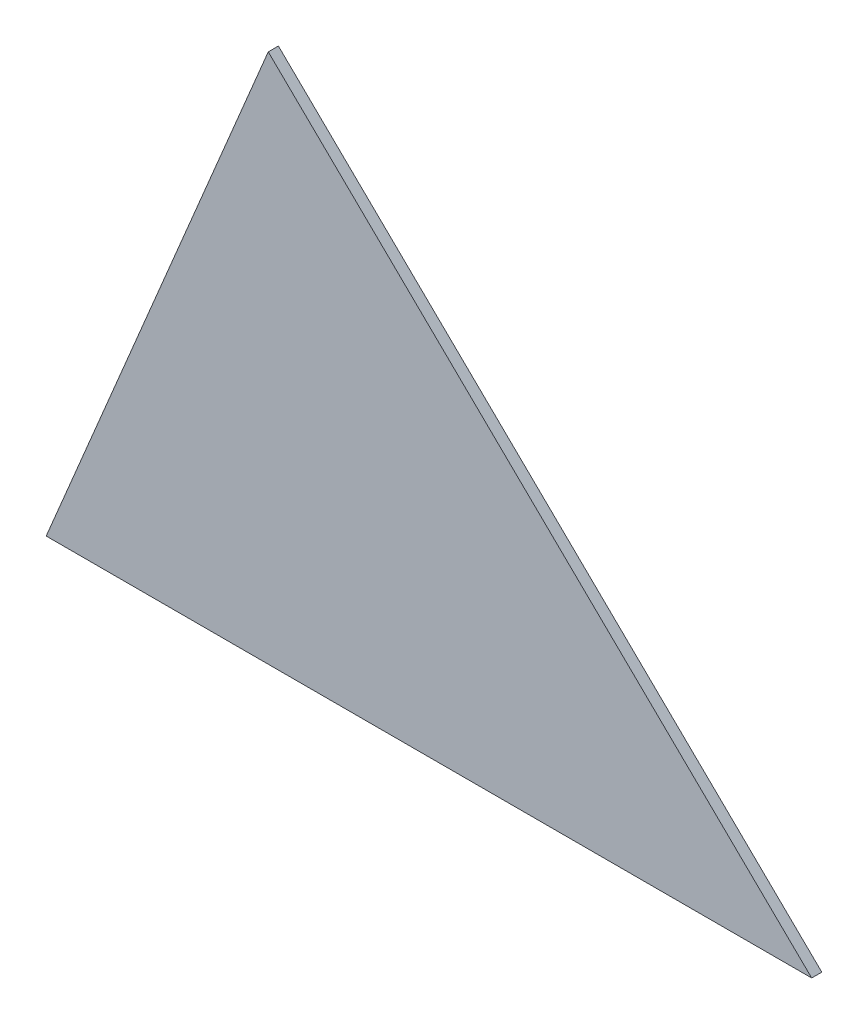
ISO-10303-21;
HEADER;
FILE_DESCRIPTION(('STEP AP214'),'2;1');
FILE_NAME('part.step','',(''),(''),'','','');
FILE_SCHEMA(('AUTOMOTIVE_DESIGN { 1 0 10303 214 1 1 1 1 }'));
ENDSEC;
DATA;
#1=APPLICATION_CONTEXT('core data for automotive mechanical design processes');
#2=APPLICATION_PROTOCOL_DEFINITION('international standard','automotive_design',2000,#1);
#3=PRODUCT_CONTEXT('',#1,'mechanical');
#4=PRODUCT('Part','Part','',(#3));
#5=PRODUCT_RELATED_PRODUCT_CATEGORY('part','',(#4));
#6=PRODUCT_DEFINITION_FORMATION('','',#4);
#7=PRODUCT_DEFINITION_CONTEXT('part definition',#1,'design');
#8=PRODUCT_DEFINITION('design','',#6,#7);
#9=PRODUCT_DEFINITION_SHAPE('','',#8);
#10=(LENGTH_UNIT() NAMED_UNIT(*) SI_UNIT(.MILLI.,.METRE.));
#11=(NAMED_UNIT(*) PLANE_ANGLE_UNIT() SI_UNIT($,.RADIAN.));
#12=(NAMED_UNIT(*) SI_UNIT($,.STERADIAN.) SOLID_ANGLE_UNIT());
#13=UNCERTAINTY_MEASURE_WITH_UNIT(LENGTH_MEASURE(1.E-05),#10,'distance_accuracy_value','');
#14=(GEOMETRIC_REPRESENTATION_CONTEXT(3) GLOBAL_UNCERTAINTY_ASSIGNED_CONTEXT((#13)) GLOBAL_UNIT_ASSIGNED_CONTEXT((#10,
#11,#12)) REPRESENTATION_CONTEXT('',''));
#15=CARTESIAN_POINT('',(0.,0.,0.));
#16=DIRECTION('',(0.,0.,1.));
#17=DIRECTION('',(1.,0.,0.));
#18=AXIS2_PLACEMENT_3D('',#15,#16,#17);
#19=CARTESIAN_POINT('',(45.6738082061823,-22.0627717606135,-1.));
#20=DIRECTION('',(0.698452825949152,0.715656097524254,0.));
#21=DIRECTION('',(-0.715656097524254,0.698452825949152,0.));
#22=AXIS2_PLACEMENT_3D('',#19,#20,#21);
#23=PLANE('',#22);
#24=DIRECTION('',(-0.715656097524254,0.698452825949152,0.));
#25=VECTOR('',#24,1.);
#26=CARTESIAN_POINT('',(45.6738082061823,-22.0627717606135,0.));
#27=LINE('',#26,#25);
#28=CARTESIAN_POINT('',(45.6738082061823,-22.0627717606135,0.));
#29=VERTEX_POINT('',#28);
#30=CARTESIAN_POINT('',(-7.99936753893587,30.3201834137086,0.));
#31=VERTEX_POINT('',#30);
#32=EDGE_CURVE('E92',#29,#31,#27,.T.);
#33=ORIENTED_EDGE('',*,*,#32,.F.);
#34=DIRECTION('',(0.,0.,1.));
#35=VECTOR('',#34,1.);
#36=CARTESIAN_POINT('',(45.6738082061823,-22.0627717606135,-1.));
#37=LINE('',#36,#35);
#38=CARTESIAN_POINT('',(45.6738082061823,-22.0627717606135,-1.));
#39=VERTEX_POINT('',#38);
#40=EDGE_CURVE('E12',#39,#29,#37,.T.);
#41=ORIENTED_EDGE('',*,*,#40,.F.);
#42=DIRECTION('',(-0.715656097524254,0.698452825949152,0.));
#43=VECTOR('',#42,1.);
#44=CARTESIAN_POINT('',(45.6738082061823,-22.0627717606135,-1.));
#45=LINE('',#44,#43);
#46=CARTESIAN_POINT('',(-7.99936753893587,30.3201834137086,-1.));
#47=VERTEX_POINT('',#46);
#48=EDGE_CURVE('E84',#39,#47,#45,.T.);
#49=ORIENTED_EDGE('',*,*,#48,.T.);
#50=DIRECTION('',(0.,0.,1.));
#51=VECTOR('',#50,1.);
#52=CARTESIAN_POINT('',(-7.99936753893587,30.3201834137086,-1.));
#53=LINE('',#52,#51);
#54=EDGE_CURVE('E43',#47,#31,#53,.T.);
#55=ORIENTED_EDGE('',*,*,#54,.T.);
#56=EDGE_LOOP('',(#33,#41,#49,#55));
#57=FACE_BOUND('',#56,.T.);
#58=ADVANCED_FACE('F40',(#57),#23,.T.);
#59=CARTESIAN_POINT('',(-29.9331172424698,-22.0627717606135,-1.));
#60=DIRECTION('',(0.,-1.,0.));
#61=DIRECTION('',(0.,0.,-1.));
#62=AXIS2_PLACEMENT_3D('',#59,#60,#61);
#63=PLANE('',#62);
#64=DIRECTION('',(1.,0.,0.));
#65=VECTOR('',#64,1.);
#66=CARTESIAN_POINT('',(-29.9331172424698,-22.0627717606135,0.));
#67=LINE('',#66,#65);
#68=CARTESIAN_POINT('',(-29.9331172424698,-22.0627717606135,0.));
#69=VERTEX_POINT('',#68);
#70=EDGE_CURVE('E86',#69,#29,#67,.T.);
#71=ORIENTED_EDGE('',*,*,#70,.F.);
#72=DIRECTION('',(0.,0.,1.));
#73=VECTOR('',#72,1.);
#74=CARTESIAN_POINT('',(-29.9331172424698,-22.0627717606135,-1.));
#75=LINE('',#74,#73);
#76=CARTESIAN_POINT('',(-29.9331172424698,-22.0627717606135,-1.));
#77=VERTEX_POINT('',#76);
#78=EDGE_CURVE('E49',#77,#69,#75,.T.);
#79=ORIENTED_EDGE('',*,*,#78,.F.);
#80=DIRECTION('',(1.,0.,0.));
#81=VECTOR('',#80,1.);
#82=CARTESIAN_POINT('',(-29.9331172424698,-22.0627717606135,-1.));
#83=LINE('',#82,#81);
#84=EDGE_CURVE('E81',#77,#39,#83,.T.);
#85=ORIENTED_EDGE('',*,*,#84,.T.);
#86=ORIENTED_EDGE('',*,*,#40,.T.);
#87=EDGE_LOOP('',(#71,#79,#85,#86));
#88=FACE_BOUND('',#87,.T.);
#89=ADVANCED_FACE('F102',(#88),#63,.T.);
#90=CARTESIAN_POINT('',(-7.99936753893587,30.3201834137086,-1.));
#91=DIRECTION('',(-0.92240334495947,0.386228001584015,0.));
#92=DIRECTION('',(-0.386228001584015,-0.92240334495947,0.));
#93=AXIS2_PLACEMENT_3D('',#90,#91,#92);
#94=PLANE('',#93);
#95=DIRECTION('',(-0.386228001584015,-0.92240334495947,0.));
#96=VECTOR('',#95,1.);
#97=CARTESIAN_POINT('',(-7.99936753893587,30.3201834137086,0.));
#98=LINE('',#97,#96);
#99=EDGE_CURVE('E79',#31,#69,#98,.T.);
#100=ORIENTED_EDGE('',*,*,#99,.F.);
#101=ORIENTED_EDGE('',*,*,#54,.F.);
#102=DIRECTION('',(-0.386228001584015,-0.92240334495947,0.));
#103=VECTOR('',#102,1.);
#104=CARTESIAN_POINT('',(-7.99936753893587,30.3201834137086,-1.));
#105=LINE('',#104,#103);
#106=EDGE_CURVE('E77',#47,#77,#105,.T.);
#107=ORIENTED_EDGE('',*,*,#106,.T.);
#108=ORIENTED_EDGE('',*,*,#78,.T.);
#109=EDGE_LOOP('',(#100,#101,#107,#108));
#110=FACE_BOUND('',#109,.T.);
#111=ADVANCED_FACE('F76',(#110),#94,.T.);
#112=CARTESIAN_POINT('',(0.,0.,-1.));
#113=DIRECTION('',(0.,0.,1.));
#114=DIRECTION('',(1.,0.,0.));
#115=AXIS2_PLACEMENT_3D('',#112,#113,#114);
#116=PLANE('',#115);
#117=ORIENTED_EDGE('',*,*,#48,.F.);
#118=ORIENTED_EDGE('',*,*,#84,.F.);
#119=ORIENTED_EDGE('',*,*,#106,.F.);
#120=EDGE_LOOP('',(#117,#118,#119));
#121=FACE_BOUND('',#120,.T.);
#122=ADVANCED_FACE('F83',(#121),#116,.F.);
#123=CARTESIAN_POINT('',(0.,0.,0.));
#124=DIRECTION('',(0.,0.,1.));
#125=DIRECTION('',(1.,0.,0.));
#126=AXIS2_PLACEMENT_3D('',#123,#124,#125);
#127=PLANE('',#126);
#128=ORIENTED_EDGE('',*,*,#32,.T.);
#129=ORIENTED_EDGE('',*,*,#99,.T.);
#130=ORIENTED_EDGE('',*,*,#70,.T.);
#131=EDGE_LOOP('',(#128,#129,#130));
#132=FACE_BOUND('',#131,.T.);
#133=ADVANCED_FACE('F101',(#132),#127,.T.);
#134=CLOSED_SHELL('',(#58,#89,#111,#122,#133));
#135=MANIFOLD_SOLID_BREP('B2',#134);
#136=ADVANCED_BREP_SHAPE_REPRESENTATION('',(#18,#135),#14);
#137=SHAPE_DEFINITION_REPRESENTATION(#9,#136);
ENDSEC;
END-ISO-10303-21;
